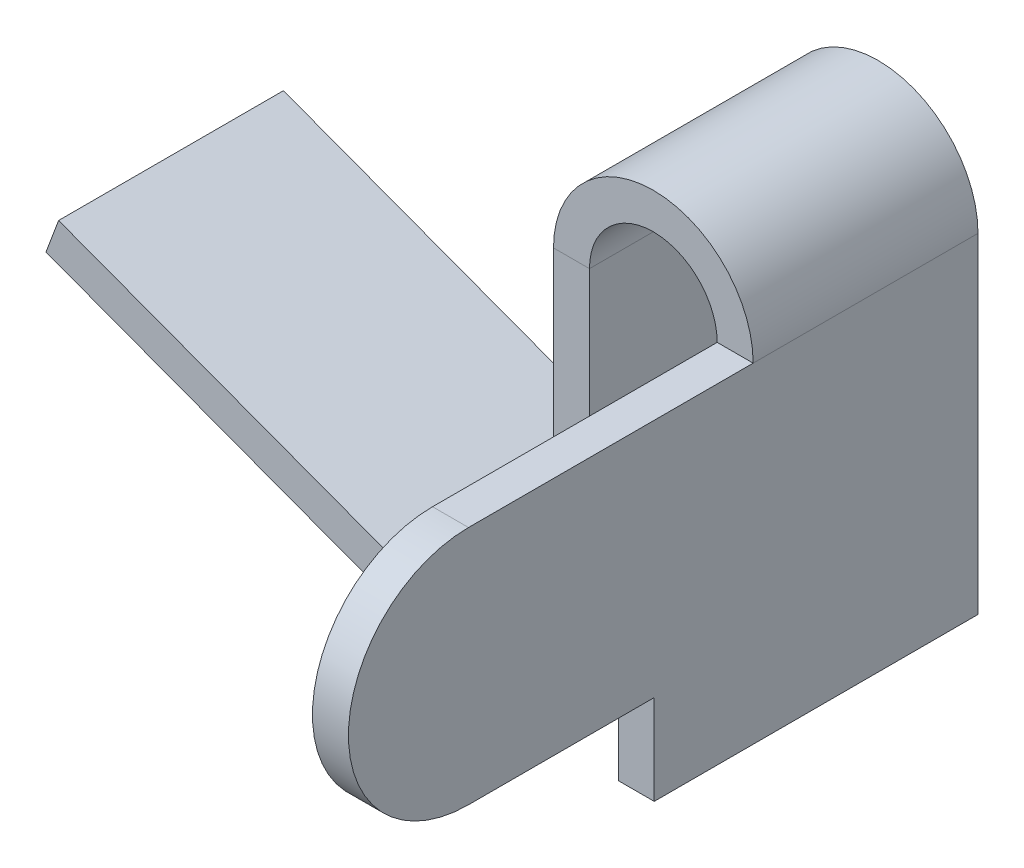
ISO-10303-21;
HEADER;
FILE_DESCRIPTION(('STEP AP214'),'2;1');
FILE_NAME('part.step','',(''),(''),'','','');
FILE_SCHEMA(('AUTOMOTIVE_DESIGN { 1 0 10303 214 1 1 1 1 }'));
ENDSEC;
DATA;
#1=APPLICATION_CONTEXT('core data for automotive mechanical design processes');
#2=APPLICATION_PROTOCOL_DEFINITION('international standard','automotive_design',2000,#1);
#3=PRODUCT_CONTEXT('',#1,'mechanical');
#4=PRODUCT('Part','Part','',(#3));
#5=PRODUCT_RELATED_PRODUCT_CATEGORY('part','',(#4));
#6=PRODUCT_DEFINITION_FORMATION('','',#4);
#7=PRODUCT_DEFINITION_CONTEXT('part definition',#1,'design');
#8=PRODUCT_DEFINITION('design','',#6,#7);
#9=PRODUCT_DEFINITION_SHAPE('','',#8);
#10=(LENGTH_UNIT() NAMED_UNIT(*) SI_UNIT(.MILLI.,.METRE.));
#11=(NAMED_UNIT(*) PLANE_ANGLE_UNIT() SI_UNIT($,.RADIAN.));
#12=(NAMED_UNIT(*) SI_UNIT($,.STERADIAN.) SOLID_ANGLE_UNIT());
#13=UNCERTAINTY_MEASURE_WITH_UNIT(LENGTH_MEASURE(1.E-05),#10,'distance_accuracy_value','');
#14=(GEOMETRIC_REPRESENTATION_CONTEXT(3) GLOBAL_UNCERTAINTY_ASSIGNED_CONTEXT((#13)) GLOBAL_UNIT_ASSIGNED_CONTEXT((#10,
#11,#12)) REPRESENTATION_CONTEXT('',''));
#15=CARTESIAN_POINT('',(0.,0.,0.));
#16=DIRECTION('',(0.,0.,1.));
#17=DIRECTION('',(1.,0.,0.));
#18=AXIS2_PLACEMENT_3D('',#15,#16,#17);
#19=CARTESIAN_POINT('',(0.71,0.5,5.665));
#20=DIRECTION('',(-1.,0.,0.));
#21=DIRECTION('',(0.,0.,1.));
#22=AXIS2_PLACEMENT_3D('',#19,#20,#21);
#23=CYLINDRICAL_SURFACE('',#22,1.335);
#24=DIRECTION('',(1.,0.,0.));
#25=VECTOR('',#24,1.);
#26=CARTESIAN_POINT('',(0.71,1.835,5.665));
#27=LINE('',#26,#25);
#28=CARTESIAN_POINT('',(0.71,1.835,5.665));
#29=VERTEX_POINT('',#28);
#30=CARTESIAN_POINT('',(1.11,1.835,5.665));
#31=VERTEX_POINT('',#30);
#32=EDGE_CURVE('E211',#29,#31,#27,.T.);
#33=ORIENTED_EDGE('',*,*,#32,.F.);
#34=CARTESIAN_POINT('',(0.71,0.5,5.665));
#35=DIRECTION('',(-1.,0.,0.));
#36=DIRECTION('',(0.,0.,1.));
#37=AXIS2_PLACEMENT_3D('',#34,#35,#36);
#38=CIRCLE('',#37,1.335);
#39=CARTESIAN_POINT('',(0.71,-0.835,5.665));
#40=VERTEX_POINT('',#39);
#41=EDGE_CURVE('E49',#40,#29,#38,.T.);
#42=ORIENTED_EDGE('',*,*,#41,.F.);
#43=DIRECTION('',(1.,0.,0.));
#44=VECTOR('',#43,1.);
#45=CARTESIAN_POINT('',(0.71,-0.835,5.665));
#46=LINE('',#45,#44);
#47=CARTESIAN_POINT('',(1.11,-0.835,5.665));
#48=VERTEX_POINT('',#47);
#49=EDGE_CURVE('E214',#48,#40,#46,.F.);
#50=ORIENTED_EDGE('',*,*,#49,.F.);
#51=CARTESIAN_POINT('',(1.11,0.5,5.665));
#52=DIRECTION('',(-1.,0.,0.));
#53=DIRECTION('',(0.,0.,1.));
#54=AXIS2_PLACEMENT_3D('',#51,#52,#53);
#55=CIRCLE('',#54,1.335);
#56=EDGE_CURVE('E11',#31,#48,#55,.F.);
#57=ORIENTED_EDGE('',*,*,#56,.F.);
#58=EDGE_LOOP('',(#33,#42,#50,#57));
#59=FACE_BOUND('',#58,.T.);
#60=ADVANCED_FACE('F41',(#59),#23,.T.);
#61=CARTESIAN_POINT('',(0.71,-1.835,2.5));
#62=DIRECTION('',(-1.,0.,0.));
#63=DIRECTION('',(0.,0.,1.));
#64=AXIS2_PLACEMENT_3D('',#61,#62,#63);
#65=PLANE('',#64);
#66=DIRECTION('',(0.,0.,-1.));
#67=VECTOR('',#66,1.);
#68=CARTESIAN_POINT('',(0.71,-0.834999999999999,2.5));
#69=LINE('',#68,#67);
#70=CARTESIAN_POINT('',(0.71,-0.835,3.6));
#71=VERTEX_POINT('',#70);
#72=EDGE_CURVE('E220',#40,#71,#69,.T.);
#73=ORIENTED_EDGE('',*,*,#72,.F.);
#74=ORIENTED_EDGE('',*,*,#41,.T.);
#75=DIRECTION('',(0.,0.,-1.));
#76=VECTOR('',#75,1.);
#77=CARTESIAN_POINT('',(0.71,1.835,7.));
#78=LINE('',#77,#76);
#79=CARTESIAN_POINT('',(0.71,1.835,2.5));
#80=VERTEX_POINT('',#79);
#81=EDGE_CURVE('E219',#29,#80,#78,.T.);
#82=ORIENTED_EDGE('',*,*,#81,.T.);
#83=DIRECTION('',(0.,0.,-1.));
#84=VECTOR('',#83,1.);
#85=CARTESIAN_POINT('',(0.71,1.835,2.5));
#86=LINE('',#85,#84);
#87=CARTESIAN_POINT('',(0.71,1.835,0.));
#88=VERTEX_POINT('',#87);
#89=EDGE_CURVE('E172',#80,#88,#86,.T.);
#90=ORIENTED_EDGE('',*,*,#89,.T.);
#91=DIRECTION('',(0.,1.,0.));
#92=VECTOR('',#91,1.);
#93=CARTESIAN_POINT('',(0.71,-1.835,0.));
#94=LINE('',#93,#92);
#95=CARTESIAN_POINT('',(0.71,-1.835,0.));
#96=VERTEX_POINT('',#95);
#97=EDGE_CURVE('E276',#96,#88,#94,.T.);
#98=ORIENTED_EDGE('',*,*,#97,.F.);
#99=DIRECTION('',(0.,0.,-1.));
#100=VECTOR('',#99,1.);
#101=CARTESIAN_POINT('',(0.71,-1.835,2.5));
#102=LINE('',#101,#100);
#103=CARTESIAN_POINT('',(0.71,-1.835,3.6));
#104=VERTEX_POINT('',#103);
#105=EDGE_CURVE('E169',#104,#96,#102,.T.);
#106=ORIENTED_EDGE('',*,*,#105,.F.);
#107=DIRECTION('',(0.,-1.,0.));
#108=VECTOR('',#107,1.);
#109=CARTESIAN_POINT('',(0.71,-1.835,3.6));
#110=LINE('',#109,#108);
#111=EDGE_CURVE('E152',#71,#104,#110,.T.);
#112=ORIENTED_EDGE('',*,*,#111,.F.);
#113=EDGE_LOOP('',(#73,#74,#82,#90,#98,#106,#112));
#114=FACE_BOUND('',#113,.T.);
#115=ADVANCED_FACE('F217',(#114),#65,.T.);
#116=CARTESIAN_POINT('',(1.11,-1.835,2.5));
#117=DIRECTION('',(0.,-1.,0.));
#118=DIRECTION('',(0.,0.,-1.));
#119=AXIS2_PLACEMENT_3D('',#116,#117,#118);
#120=PLANE('',#119);
#121=DIRECTION('',(0.,0.,-1.));
#122=VECTOR('',#121,1.);
#123=CARTESIAN_POINT('',(1.11,-1.835,2.5));
#124=LINE('',#123,#122);
#125=CARTESIAN_POINT('',(1.11,-1.835,3.6));
#126=VERTEX_POINT('',#125);
#127=CARTESIAN_POINT('',(1.11,-1.835,0.));
#128=VERTEX_POINT('',#127);
#129=EDGE_CURVE('E160',#126,#128,#124,.T.);
#130=ORIENTED_EDGE('',*,*,#129,.F.);
#131=DIRECTION('',(-1.,0.,0.));
#132=VECTOR('',#131,1.);
#133=CARTESIAN_POINT('',(0.71,-1.835,3.6));
#134=LINE('',#133,#132);
#135=EDGE_CURVE('E145',#104,#126,#134,.F.);
#136=ORIENTED_EDGE('',*,*,#135,.F.);
#137=ORIENTED_EDGE('',*,*,#105,.T.);
#138=DIRECTION('',(-1.,0.,0.));
#139=VECTOR('',#138,1.);
#140=CARTESIAN_POINT('',(1.11,-1.835,0.));
#141=LINE('',#140,#139);
#142=EDGE_CURVE('E168',#128,#96,#141,.T.);
#143=ORIENTED_EDGE('',*,*,#142,.F.);
#144=EDGE_LOOP('',(#130,#136,#137,#143));
#145=FACE_BOUND('',#144,.T.);
#146=ADVANCED_FACE('F166',(#145),#120,.T.);
#147=CARTESIAN_POINT('',(1.11,-1.835,2.5));
#148=DIRECTION('',(-1.,0.,0.));
#149=DIRECTION('',(0.,0.,1.));
#150=AXIS2_PLACEMENT_3D('',#147,#148,#149);
#151=PLANE('',#150);
#152=DIRECTION('',(0.,0.,-1.));
#153=VECTOR('',#152,1.);
#154=CARTESIAN_POINT('',(1.11,1.835,7.));
#155=LINE('',#154,#153);
#156=CARTESIAN_POINT('',(1.11,1.835,2.5));
#157=VERTEX_POINT('',#156);
#158=EDGE_CURVE('E225',#31,#157,#155,.T.);
#159=ORIENTED_EDGE('',*,*,#158,.F.);
#160=ORIENTED_EDGE('',*,*,#56,.T.);
#161=DIRECTION('',(0.,0.,1.));
#162=VECTOR('',#161,1.);
#163=CARTESIAN_POINT('',(1.11,-0.835,2.5));
#164=LINE('',#163,#162);
#165=CARTESIAN_POINT('',(1.11,-0.835,3.6));
#166=VERTEX_POINT('',#165);
#167=EDGE_CURVE('E163',#48,#166,#164,.F.);
#168=ORIENTED_EDGE('',*,*,#167,.T.);
#169=DIRECTION('',(0.,1.,0.));
#170=VECTOR('',#169,1.);
#171=CARTESIAN_POINT('',(1.11,-1.835,3.6));
#172=LINE('',#171,#170);
#173=EDGE_CURVE('E149',#166,#126,#172,.F.);
#174=ORIENTED_EDGE('',*,*,#173,.T.);
#175=ORIENTED_EDGE('',*,*,#129,.T.);
#176=DIRECTION('',(0.,1.,0.));
#177=VECTOR('',#176,1.);
#178=CARTESIAN_POINT('',(1.11,-1.835,0.));
#179=LINE('',#178,#177);
#180=CARTESIAN_POINT('',(1.11,1.835,0.));
#181=VERTEX_POINT('',#180);
#182=EDGE_CURVE('E280',#128,#181,#179,.T.);
#183=ORIENTED_EDGE('',*,*,#182,.T.);
#184=DIRECTION('',(0.,0.,-1.));
#185=VECTOR('',#184,1.);
#186=CARTESIAN_POINT('',(1.11,1.835,2.5));
#187=LINE('',#186,#185);
#188=EDGE_CURVE('E170',#157,#181,#187,.T.);
#189=ORIENTED_EDGE('',*,*,#188,.F.);
#190=EDGE_LOOP('',(#159,#160,#168,#174,#175,#183,#189));
#191=FACE_BOUND('',#190,.T.);
#192=ADVANCED_FACE('F158',(#191),#151,.F.);
#193=CARTESIAN_POINT('',(-0.71,1.835,2.5));
#194=DIRECTION('',(0.,0.,1.));
#195=DIRECTION('',(1.,0.,0.));
#196=AXIS2_PLACEMENT_3D('',#193,#194,#195);
#197=PLANE('',#196);
#198=DIRECTION('',(-1.,0.,0.));
#199=VECTOR('',#198,1.);
#200=CARTESIAN_POINT('',(-0.71,1.835,2.5));
#201=LINE('',#200,#199);
#202=CARTESIAN_POINT('',(-0.71,1.835,2.5));
#203=VERTEX_POINT('',#202);
#204=CARTESIAN_POINT('',(-1.11,1.835,2.5));
#205=VERTEX_POINT('',#204);
#206=EDGE_CURVE('E209',#203,#205,#201,.T.);
#207=ORIENTED_EDGE('',*,*,#206,.F.);
#208=CARTESIAN_POINT('',(0.,1.835,2.5));
#209=DIRECTION('',(0.,0.,1.));
#210=DIRECTION('',(1.,0.,0.));
#211=AXIS2_PLACEMENT_3D('',#208,#209,#210);
#212=CIRCLE('',#211,0.71);
#213=EDGE_CURVE('E246',#80,#203,#212,.T.);
#214=ORIENTED_EDGE('',*,*,#213,.F.);
#215=DIRECTION('',(-1.,0.,0.));
#216=VECTOR('',#215,1.);
#217=CARTESIAN_POINT('',(1.11,1.835,2.5));
#218=LINE('',#217,#216);
#219=EDGE_CURVE('E206',#157,#80,#218,.T.);
#220=ORIENTED_EDGE('',*,*,#219,.F.);
#221=CARTESIAN_POINT('',(0.,1.835,2.5));
#222=DIRECTION('',(0.,0.,1.));
#223=DIRECTION('',(1.,0.,0.));
#224=AXIS2_PLACEMENT_3D('',#221,#222,#223);
#225=CIRCLE('',#224,1.11);
#226=EDGE_CURVE('E249',#157,#205,#225,.T.);
#227=ORIENTED_EDGE('',*,*,#226,.T.);
#228=EDGE_LOOP('',(#207,#214,#220,#227));
#229=FACE_BOUND('',#228,.T.);
#230=ADVANCED_FACE('F344',(#229),#197,.T.);
#231=CARTESIAN_POINT('',(1.11,1.835,2.5));
#232=DIRECTION('',(0.,0.,1.));
#233=DIRECTION('',(1.,0.,0.));
#234=AXIS2_PLACEMENT_3D('',#231,#232,#233);
#235=PLANE('',#234);
#236=DIRECTION('',(0.,-1.,0.));
#237=VECTOR('',#236,1.);
#238=CARTESIAN_POINT('',(-0.71,1.835,2.5));
#239=LINE('',#238,#237);
#240=CARTESIAN_POINT('',(-0.709999999999999,-2.335,2.5));
#241=VERTEX_POINT('',#240);
#242=EDGE_CURVE('E243',#203,#241,#239,.T.);
#243=ORIENTED_EDGE('',*,*,#242,.F.);
#244=ORIENTED_EDGE('',*,*,#206,.T.);
#245=DIRECTION('',(0.,-1.,0.));
#246=VECTOR('',#245,1.);
#247=CARTESIAN_POINT('',(-1.11,1.835,2.5));
#248=LINE('',#247,#246);
#249=CARTESIAN_POINT('',(-1.11,-2.335,2.5));
#250=VERTEX_POINT('',#249);
#251=EDGE_CURVE('E252',#205,#250,#248,.T.);
#252=ORIENTED_EDGE('',*,*,#251,.T.);
#253=DIRECTION('',(1.,0.,0.));
#254=VECTOR('',#253,1.);
#255=CARTESIAN_POINT('',(-1.11,-2.335,2.5));
#256=LINE('',#255,#254);
#257=EDGE_CURVE('E198',#250,#241,#256,.T.);
#258=ORIENTED_EDGE('',*,*,#257,.T.);
#259=EDGE_LOOP('',(#243,#244,#252,#258));
#260=FACE_BOUND('',#259,.T.);
#261=ADVANCED_FACE('F341',(#260),#235,.T.);
#262=CARTESIAN_POINT('',(0.71,1.835,0.));
#263=DIRECTION('',(0.,0.,-1.));
#264=DIRECTION('',(-1.,0.,0.));
#265=AXIS2_PLACEMENT_3D('',#262,#263,#264);
#266=PLANE('',#265);
#267=DIRECTION('',(1.,0.,0.));
#268=VECTOR('',#267,1.);
#269=CARTESIAN_POINT('',(0.71,1.835,0.));
#270=LINE('',#269,#268);
#271=EDGE_CURVE('E204',#88,#181,#270,.T.);
#272=ORIENTED_EDGE('',*,*,#271,.F.);
#273=CARTESIAN_POINT('',(0.,1.835,0.));
#274=DIRECTION('',(0.,0.,1.));
#275=DIRECTION('',(1.,0.,0.));
#276=AXIS2_PLACEMENT_3D('',#273,#274,#275);
#277=CIRCLE('',#276,0.71);
#278=CARTESIAN_POINT('',(-0.71,1.835,0.));
#279=VERTEX_POINT('',#278);
#280=EDGE_CURVE('E273',#88,#279,#277,.T.);
#281=ORIENTED_EDGE('',*,*,#280,.T.);
#282=DIRECTION('',(1.,0.,0.));
#283=VECTOR('',#282,1.);
#284=CARTESIAN_POINT('',(-1.11,1.835,0.));
#285=LINE('',#284,#283);
#286=CARTESIAN_POINT('',(-1.11,1.835,0.));
#287=VERTEX_POINT('',#286);
#288=EDGE_CURVE('E202',#287,#279,#285,.T.);
#289=ORIENTED_EDGE('',*,*,#288,.F.);
#290=CARTESIAN_POINT('',(0.,1.835,0.));
#291=DIRECTION('',(0.,0.,1.));
#292=DIRECTION('',(1.,0.,0.));
#293=AXIS2_PLACEMENT_3D('',#290,#291,#292);
#294=CIRCLE('',#293,1.11);
#295=EDGE_CURVE('E282',#181,#287,#294,.T.);
#296=ORIENTED_EDGE('',*,*,#295,.F.);
#297=EDGE_LOOP('',(#272,#281,#289,#296));
#298=FACE_BOUND('',#297,.T.);
#299=ADVANCED_FACE('F349',(#298),#266,.T.);
#300=CARTESIAN_POINT('',(-1.11,1.835,0.));
#301=DIRECTION('',(0.,0.,-1.));
#302=DIRECTION('',(-1.,0.,0.));
#303=AXIS2_PLACEMENT_3D('',#300,#301,#302);
#304=PLANE('',#303);
#305=ORIENTED_EDGE('',*,*,#97,.T.);
#306=ORIENTED_EDGE('',*,*,#271,.T.);
#307=ORIENTED_EDGE('',*,*,#182,.F.);
#308=ORIENTED_EDGE('',*,*,#142,.T.);
#309=EDGE_LOOP('',(#305,#306,#307,#308));
#310=FACE_BOUND('',#309,.T.);
#311=ADVANCED_FACE('F355',(#310),#304,.T.);
#312=CARTESIAN_POINT('',(-1.60113687163125,-2.95320364490394,2.5));
#313=DIRECTION('',(0.,0.,1.));
#314=DIRECTION('',(1.,0.,0.));
#315=AXIS2_PLACEMENT_3D('',#312,#313,#314);
#316=PLANE('',#315);
#317=DIRECTION('',(0.350207381259472,0.936672189248396,0.));
#318=VECTOR('',#317,1.);
#319=CARTESIAN_POINT('',(-1.60113687163125,-2.95320364490394,2.5));
#320=LINE('',#319,#318);
#321=CARTESIAN_POINT('',(-1.60113687163125,-2.95320364490394,2.5));
#322=VERTEX_POINT('',#321);
#323=CARTESIAN_POINT('',(-1.46105391912746,-2.57853476920458,2.5));
#324=VERTEX_POINT('',#323);
#325=EDGE_CURVE('E200',#322,#324,#320,.T.);
#326=ORIENTED_EDGE('',*,*,#325,.F.);
#327=CARTESIAN_POINT('',(-1.37,-2.335,2.5));
#328=DIRECTION('',(0.,0.,-1.));
#329=DIRECTION('',(-1.,0.,0.));
#330=AXIS2_PLACEMENT_3D('',#327,#328,#329);
#331=CIRCLE('',#330,0.66);
#332=EDGE_CURVE('E240',#241,#322,#331,.T.);
#333=ORIENTED_EDGE('',*,*,#332,.F.);
#334=ORIENTED_EDGE('',*,*,#257,.F.);
#335=CARTESIAN_POINT('',(-1.37,-2.335,2.5));
#336=DIRECTION('',(0.,0.,1.));
#337=DIRECTION('',(1.,0.,0.));
#338=AXIS2_PLACEMENT_3D('',#335,#336,#337);
#339=CIRCLE('',#338,0.26);
#340=EDGE_CURVE('E255',#250,#324,#339,.F.);
#341=ORIENTED_EDGE('',*,*,#340,.T.);
#342=EDGE_LOOP('',(#326,#333,#334,#341));
#343=FACE_BOUND('',#342,.T.);
#344=ADVANCED_FACE('F339',(#343),#316,.T.);
#345=CARTESIAN_POINT('',(-1.11,-2.335,2.5));
#346=DIRECTION('',(0.,0.,1.));
#347=DIRECTION('',(1.,0.,0.));
#348=AXIS2_PLACEMENT_3D('',#345,#346,#347);
#349=PLANE('',#348);
#350=DIRECTION('',(-0.936672189248396,0.350207381259472,0.));
#351=VECTOR('',#350,1.);
#352=CARTESIAN_POINT('',(-1.60113687163125,-2.95320364490394,2.5));
#353=LINE('',#352,#351);
#354=CARTESIAN_POINT('',(-6.75283391249743,-1.02706304797685,2.5));
#355=VERTEX_POINT('',#354);
#356=EDGE_CURVE('E237',#322,#355,#353,.T.);
#357=ORIENTED_EDGE('',*,*,#356,.F.);
#358=ORIENTED_EDGE('',*,*,#325,.T.);
#359=DIRECTION('',(-0.936672189248396,0.350207381259472,0.));
#360=VECTOR('',#359,1.);
#361=CARTESIAN_POINT('',(-1.46105391912746,-2.57853476920458,2.5));
#362=LINE('',#361,#360);
#363=CARTESIAN_POINT('',(-6.61275095999364,-0.652394172277489,2.5));
#364=VERTEX_POINT('',#363);
#365=EDGE_CURVE('E231',#324,#364,#362,.T.);
#366=ORIENTED_EDGE('',*,*,#365,.T.);
#367=DIRECTION('',(0.350207381259468,0.936672189248397,0.));
#368=VECTOR('',#367,1.);
#369=CARTESIAN_POINT('',(-6.75283391249743,-1.02706304797685,2.5));
#370=LINE('',#369,#368);
#371=EDGE_CURVE('E233',#355,#364,#370,.T.);
#372=ORIENTED_EDGE('',*,*,#371,.F.);
#373=EDGE_LOOP('',(#357,#358,#366,#372));
#374=FACE_BOUND('',#373,.T.);
#375=ADVANCED_FACE('F337',(#374),#349,.T.);
#376=CARTESIAN_POINT('',(-0.709999999999999,-2.335,0.));
#377=DIRECTION('',(0.,0.,-1.));
#378=DIRECTION('',(-1.,0.,0.));
#379=AXIS2_PLACEMENT_3D('',#376,#377,#378);
#380=PLANE('',#379);
#381=DIRECTION('',(-1.,0.,0.));
#382=VECTOR('',#381,1.);
#383=CARTESIAN_POINT('',(-0.709999999999999,-2.335,0.));
#384=LINE('',#383,#382);
#385=CARTESIAN_POINT('',(-0.709999999999999,-2.335,0.));
#386=VERTEX_POINT('',#385);
#387=CARTESIAN_POINT('',(-1.11,-2.335,0.));
#388=VERTEX_POINT('',#387);
#389=EDGE_CURVE('E196',#386,#388,#384,.T.);
#390=ORIENTED_EDGE('',*,*,#389,.F.);
#391=CARTESIAN_POINT('',(-1.37,-2.335,0.));
#392=DIRECTION('',(0.,0.,-1.));
#393=DIRECTION('',(-1.,0.,0.));
#394=AXIS2_PLACEMENT_3D('',#391,#392,#393);
#395=CIRCLE('',#394,0.66);
#396=CARTESIAN_POINT('',(-1.60113687163125,-2.95320364490394,0.));
#397=VERTEX_POINT('',#396);
#398=EDGE_CURVE('E267',#386,#397,#395,.T.);
#399=ORIENTED_EDGE('',*,*,#398,.T.);
#400=DIRECTION('',(-0.350207381259472,-0.936672189248396,0.));
#401=VECTOR('',#400,1.);
#402=CARTESIAN_POINT('',(-1.46105391912746,-2.57853476920458,0.));
#403=LINE('',#402,#401);
#404=CARTESIAN_POINT('',(-1.46105391912746,-2.57853476920458,0.));
#405=VERTEX_POINT('',#404);
#406=EDGE_CURVE('E194',#405,#397,#403,.T.);
#407=ORIENTED_EDGE('',*,*,#406,.F.);
#408=CARTESIAN_POINT('',(-1.37,-2.335,0.));
#409=DIRECTION('',(0.,0.,1.));
#410=DIRECTION('',(1.,0.,0.));
#411=AXIS2_PLACEMENT_3D('',#408,#409,#410);
#412=CIRCLE('',#411,0.26);
#413=EDGE_CURVE('E234',#388,#405,#412,.F.);
#414=ORIENTED_EDGE('',*,*,#413,.F.);
#415=EDGE_LOOP('',(#390,#399,#407,#414));
#416=FACE_BOUND('',#415,.T.);
#417=ADVANCED_FACE('F308',(#416),#380,.T.);
#418=CARTESIAN_POINT('',(-1.46105391912746,-2.57853476920458,0.));
#419=DIRECTION('',(0.,0.,-1.));
#420=DIRECTION('',(-1.,0.,0.));
#421=AXIS2_PLACEMENT_3D('',#418,#419,#420);
#422=PLANE('',#421);
#423=DIRECTION('',(0.,-1.,0.));
#424=VECTOR('',#423,1.);
#425=CARTESIAN_POINT('',(-0.71,1.835,0.));
#426=LINE('',#425,#424);
#427=EDGE_CURVE('E270',#279,#386,#426,.T.);
#428=ORIENTED_EDGE('',*,*,#427,.T.);
#429=ORIENTED_EDGE('',*,*,#389,.T.);
#430=DIRECTION('',(0.,-1.,0.));
#431=VECTOR('',#430,1.);
#432=CARTESIAN_POINT('',(-1.11,1.835,0.));
#433=LINE('',#432,#431);
#434=EDGE_CURVE('E285',#287,#388,#433,.T.);
#435=ORIENTED_EDGE('',*,*,#434,.F.);
#436=ORIENTED_EDGE('',*,*,#288,.T.);
#437=EDGE_LOOP('',(#428,#429,#435,#436));
#438=FACE_BOUND('',#437,.T.);
#439=ADVANCED_FACE('F304',(#438),#422,.T.);
#440=CARTESIAN_POINT('',(-1.46105391912746,-2.57853476920458,2.5));
#441=DIRECTION('',(-0.350207381259472,-0.936672189248396,0.));
#442=DIRECTION('',(0.936672189248396,-0.350207381259472,0.));
#443=AXIS2_PLACEMENT_3D('',#440,#441,#442);
#444=PLANE('',#443);
#445=DIRECTION('',(-0.936672189248396,0.350207381259472,0.));
#446=VECTOR('',#445,1.);
#447=CARTESIAN_POINT('',(-1.46105391912746,-2.57853476920458,0.));
#448=LINE('',#447,#446);
#449=CARTESIAN_POINT('',(-6.61275095999364,-0.652394172277489,0.));
#450=VERTEX_POINT('',#449);
#451=EDGE_CURVE('E227',#405,#450,#448,.T.);
#452=ORIENTED_EDGE('',*,*,#451,.T.);
#453=DIRECTION('',(0.,0.,-1.));
#454=VECTOR('',#453,1.);
#455=CARTESIAN_POINT('',(-6.61275095999364,-0.652394172277489,2.5));
#456=LINE('',#455,#454);
#457=EDGE_CURVE('E192',#364,#450,#456,.T.);
#458=ORIENTED_EDGE('',*,*,#457,.F.);
#459=ORIENTED_EDGE('',*,*,#365,.F.);
#460=DIRECTION('',(0.,0.,-1.));
#461=VECTOR('',#460,1.);
#462=CARTESIAN_POINT('',(-1.46105391912746,-2.57853476920458,2.5));
#463=LINE('',#462,#461);
#464=EDGE_CURVE('E258',#324,#405,#463,.T.);
#465=ORIENTED_EDGE('',*,*,#464,.T.);
#466=EDGE_LOOP('',(#452,#458,#459,#465));
#467=FACE_BOUND('',#466,.T.);
#468=ADVANCED_FACE('F333',(#467),#444,.F.);
#469=CARTESIAN_POINT('',(-6.75283391249743,-1.02706304797685,2.5));
#470=DIRECTION('',(-0.936672189248397,0.350207381259468,0.));
#471=DIRECTION('',(-0.350207381259468,-0.936672189248397,0.));
#472=AXIS2_PLACEMENT_3D('',#469,#470,#471);
#473=PLANE('',#472);
#474=DIRECTION('',(0.350207381259468,0.936672189248397,0.));
#475=VECTOR('',#474,1.);
#476=CARTESIAN_POINT('',(-6.75283391249743,-1.02706304797685,0.));
#477=LINE('',#476,#475);
#478=CARTESIAN_POINT('',(-6.75283391249743,-1.02706304797685,0.));
#479=VERTEX_POINT('',#478);
#480=EDGE_CURVE('E261',#479,#450,#477,.T.);
#481=ORIENTED_EDGE('',*,*,#480,.F.);
#482=DIRECTION('',(0.,0.,-1.));
#483=VECTOR('',#482,1.);
#484=CARTESIAN_POINT('',(-6.75283391249743,-1.02706304797685,2.5));
#485=LINE('',#484,#483);
#486=EDGE_CURVE('E190',#355,#479,#485,.T.);
#487=ORIENTED_EDGE('',*,*,#486,.F.);
#488=ORIENTED_EDGE('',*,*,#371,.T.);
#489=ORIENTED_EDGE('',*,*,#457,.T.);
#490=EDGE_LOOP('',(#481,#487,#488,#489));
#491=FACE_BOUND('',#490,.T.);
#492=ADVANCED_FACE('F387',(#491),#473,.T.);
#493=CARTESIAN_POINT('',(-1.60113687163125,-2.95320364490394,2.5));
#494=DIRECTION('',(-0.350207381259472,-0.936672189248396,0.));
#495=DIRECTION('',(0.936672189248396,-0.350207381259472,0.));
#496=AXIS2_PLACEMENT_3D('',#493,#494,#495);
#497=PLANE('',#496);
#498=DIRECTION('',(-0.936672189248396,0.350207381259472,0.));
#499=VECTOR('',#498,1.);
#500=CARTESIAN_POINT('',(-1.60113687163125,-2.95320364490394,0.));
#501=LINE('',#500,#499);
#502=EDGE_CURVE('E264',#397,#479,#501,.T.);
#503=ORIENTED_EDGE('',*,*,#502,.F.);
#504=DIRECTION('',(0.,0.,-1.));
#505=VECTOR('',#504,1.);
#506=CARTESIAN_POINT('',(-1.60113687163125,-2.95320364490394,2.5));
#507=LINE('',#506,#505);
#508=EDGE_CURVE('E187',#322,#397,#507,.T.);
#509=ORIENTED_EDGE('',*,*,#508,.F.);
#510=ORIENTED_EDGE('',*,*,#356,.T.);
#511=ORIENTED_EDGE('',*,*,#486,.T.);
#512=EDGE_LOOP('',(#503,#509,#510,#511));
#513=FACE_BOUND('',#512,.T.);
#514=ADVANCED_FACE('F322',(#513),#497,.T.);
#515=CARTESIAN_POINT('',(-1.37,-2.335,2.5));
#516=DIRECTION('',(0.,0.,-1.));
#517=DIRECTION('',(-1.,0.,0.));
#518=AXIS2_PLACEMENT_3D('',#515,#516,#517);
#519=CYLINDRICAL_SURFACE('',#518,0.66);
#520=ORIENTED_EDGE('',*,*,#398,.F.);
#521=DIRECTION('',(0.,0.,-1.));
#522=VECTOR('',#521,1.);
#523=CARTESIAN_POINT('',(-0.709999999999999,-2.335,2.5));
#524=LINE('',#523,#522);
#525=EDGE_CURVE('E184',#241,#386,#524,.T.);
#526=ORIENTED_EDGE('',*,*,#525,.F.);
#527=ORIENTED_EDGE('',*,*,#332,.T.);
#528=ORIENTED_EDGE('',*,*,#508,.T.);
#529=EDGE_LOOP('',(#520,#526,#527,#528));
#530=FACE_BOUND('',#529,.T.);
#531=ADVANCED_FACE('F317',(#530),#519,.T.);
#532=CARTESIAN_POINT('',(-0.71,1.835,2.5));
#533=DIRECTION('',(1.,0.,0.));
#534=DIRECTION('',(0.,1.,0.));
#535=AXIS2_PLACEMENT_3D('',#532,#533,#534);
#536=PLANE('',#535);
#537=ORIENTED_EDGE('',*,*,#427,.F.);
#538=DIRECTION('',(0.,0.,-1.));
#539=VECTOR('',#538,1.);
#540=CARTESIAN_POINT('',(-0.71,1.835,2.5));
#541=LINE('',#540,#539);
#542=EDGE_CURVE('E181',#203,#279,#541,.T.);
#543=ORIENTED_EDGE('',*,*,#542,.F.);
#544=ORIENTED_EDGE('',*,*,#242,.T.);
#545=ORIENTED_EDGE('',*,*,#525,.T.);
#546=EDGE_LOOP('',(#537,#543,#544,#545));
#547=FACE_BOUND('',#546,.T.);
#548=ADVANCED_FACE('F312',(#547),#536,.T.);
#549=CARTESIAN_POINT('',(0.,1.835,2.5));
#550=DIRECTION('',(0.,0.,-1.));
#551=DIRECTION('',(-1.,0.,0.));
#552=AXIS2_PLACEMENT_3D('',#549,#550,#551);
#553=CYLINDRICAL_SURFACE('',#552,0.71);
#554=ORIENTED_EDGE('',*,*,#280,.F.);
#555=ORIENTED_EDGE('',*,*,#89,.F.);
#556=ORIENTED_EDGE('',*,*,#213,.T.);
#557=ORIENTED_EDGE('',*,*,#542,.T.);
#558=EDGE_LOOP('',(#554,#555,#556,#557));
#559=FACE_BOUND('',#558,.T.);
#560=ADVANCED_FACE('F352',(#559),#553,.F.);
#561=CARTESIAN_POINT('',(0.,1.835,2.5));
#562=DIRECTION('',(0.,0.,-1.));
#563=DIRECTION('',(-1.,0.,0.));
#564=AXIS2_PLACEMENT_3D('',#561,#562,#563);
#565=CYLINDRICAL_SURFACE('',#564,1.11);
#566=ORIENTED_EDGE('',*,*,#295,.T.);
#567=DIRECTION('',(0.,0.,-1.));
#568=VECTOR('',#567,1.);
#569=CARTESIAN_POINT('',(-1.11,1.835,2.5));
#570=LINE('',#569,#568);
#571=EDGE_CURVE('E175',#205,#287,#570,.T.);
#572=ORIENTED_EDGE('',*,*,#571,.F.);
#573=ORIENTED_EDGE('',*,*,#226,.F.);
#574=ORIENTED_EDGE('',*,*,#188,.T.);
#575=EDGE_LOOP('',(#566,#572,#573,#574));
#576=FACE_BOUND('',#575,.T.);
#577=ADVANCED_FACE('F346',(#576),#565,.T.);
#578=CARTESIAN_POINT('',(-1.11,1.835,2.5));
#579=DIRECTION('',(1.,0.,0.));
#580=DIRECTION('',(0.,1.,0.));
#581=AXIS2_PLACEMENT_3D('',#578,#579,#580);
#582=PLANE('',#581);
#583=ORIENTED_EDGE('',*,*,#434,.T.);
#584=DIRECTION('',(0.,0.,-1.));
#585=VECTOR('',#584,1.);
#586=CARTESIAN_POINT('',(-1.11,-2.335,2.5));
#587=LINE('',#586,#585);
#588=EDGE_CURVE('E292',#250,#388,#587,.T.);
#589=ORIENTED_EDGE('',*,*,#588,.F.);
#590=ORIENTED_EDGE('',*,*,#251,.F.);
#591=ORIENTED_EDGE('',*,*,#571,.T.);
#592=EDGE_LOOP('',(#583,#589,#590,#591));
#593=FACE_BOUND('',#592,.T.);
#594=ADVANCED_FACE('F299',(#593),#582,.F.);
#595=CARTESIAN_POINT('',(-1.37,-2.335,2.5));
#596=DIRECTION('',(0.,0.,-1.));
#597=DIRECTION('',(-1.,0.,0.));
#598=AXIS2_PLACEMENT_3D('',#595,#596,#597);
#599=CYLINDRICAL_SURFACE('',#598,0.26);
#600=ORIENTED_EDGE('',*,*,#413,.T.);
#601=ORIENTED_EDGE('',*,*,#464,.F.);
#602=ORIENTED_EDGE('',*,*,#340,.F.);
#603=ORIENTED_EDGE('',*,*,#588,.T.);
#604=EDGE_LOOP('',(#600,#601,#602,#603));
#605=FACE_BOUND('',#604,.T.);
#606=ADVANCED_FACE('F329',(#605),#599,.F.);
#607=CARTESIAN_POINT('',(-1.37,-2.335,0.));
#608=DIRECTION('',(0.,0.,-1.));
#609=DIRECTION('',(-1.,0.,0.));
#610=AXIS2_PLACEMENT_3D('',#607,#608,#609);
#611=PLANE('',#610);
#612=ORIENTED_EDGE('',*,*,#451,.F.);
#613=ORIENTED_EDGE('',*,*,#406,.T.);
#614=ORIENTED_EDGE('',*,*,#502,.T.);
#615=ORIENTED_EDGE('',*,*,#480,.T.);
#616=EDGE_LOOP('',(#612,#613,#614,#615));
#617=FACE_BOUND('',#616,.T.);
#618=ADVANCED_FACE('F326',(#617),#611,.T.);
#619=CARTESIAN_POINT('',(1.11,1.835,7.));
#620=DIRECTION('',(0.,-1.,0.));
#621=DIRECTION('',(0.,0.,-1.));
#622=AXIS2_PLACEMENT_3D('',#619,#620,#621);
#623=PLANE('',#622);
#624=ORIENTED_EDGE('',*,*,#81,.F.);
#625=ORIENTED_EDGE('',*,*,#32,.T.);
#626=ORIENTED_EDGE('',*,*,#158,.T.);
#627=ORIENTED_EDGE('',*,*,#219,.T.);
#628=EDGE_LOOP('',(#624,#625,#626,#627));
#629=FACE_BOUND('',#628,.T.);
#630=ADVANCED_FACE('F222',(#629),#623,.F.);
#631=CARTESIAN_POINT('',(0.71,-1.835,3.6));
#632=DIRECTION('',(0.,0.,-1.));
#633=DIRECTION('',(0.,-1.,0.));
#634=AXIS2_PLACEMENT_3D('',#631,#632,#633);
#635=PLANE('',#634);
#636=DIRECTION('',(-1.,0.,0.));
#637=VECTOR('',#636,1.);
#638=CARTESIAN_POINT('',(0.71,-0.835,3.6));
#639=LINE('',#638,#637);
#640=EDGE_CURVE('E156',#71,#166,#639,.F.);
#641=ORIENTED_EDGE('',*,*,#640,.F.);
#642=ORIENTED_EDGE('',*,*,#111,.T.);
#643=ORIENTED_EDGE('',*,*,#135,.T.);
#644=ORIENTED_EDGE('',*,*,#173,.F.);
#645=EDGE_LOOP('',(#641,#642,#643,#644));
#646=FACE_BOUND('',#645,.T.);
#647=ADVANCED_FACE('F148',(#646),#635,.F.);
#648=CARTESIAN_POINT('',(0.71,-0.834999999999999,2.5));
#649=DIRECTION('',(0.,1.,0.));
#650=DIRECTION('',(0.,0.,-1.));
#651=AXIS2_PLACEMENT_3D('',#648,#649,#650);
#652=PLANE('',#651);
#653=ORIENTED_EDGE('',*,*,#167,.F.);
#654=ORIENTED_EDGE('',*,*,#49,.T.);
#655=ORIENTED_EDGE('',*,*,#72,.T.);
#656=ORIENTED_EDGE('',*,*,#640,.T.);
#657=EDGE_LOOP('',(#653,#654,#655,#656));
#658=FACE_BOUND('',#657,.T.);
#659=ADVANCED_FACE('F360',(#658),#652,.F.);
#660=CLOSED_SHELL('',(#60,#115,#146,#192,#230,#261,#299,#311,#344,#375,#417,#439,#468,#492,#514,
#531,#548,#560,#577,#594,#606,#618,#630,#647,#659));
#661=MANIFOLD_SOLID_BREP('B2',#660);
#662=ADVANCED_BREP_SHAPE_REPRESENTATION('',(#18,#661),#14);
#663=SHAPE_DEFINITION_REPRESENTATION(#9,#662);
ENDSEC;
END-ISO-10303-21;
